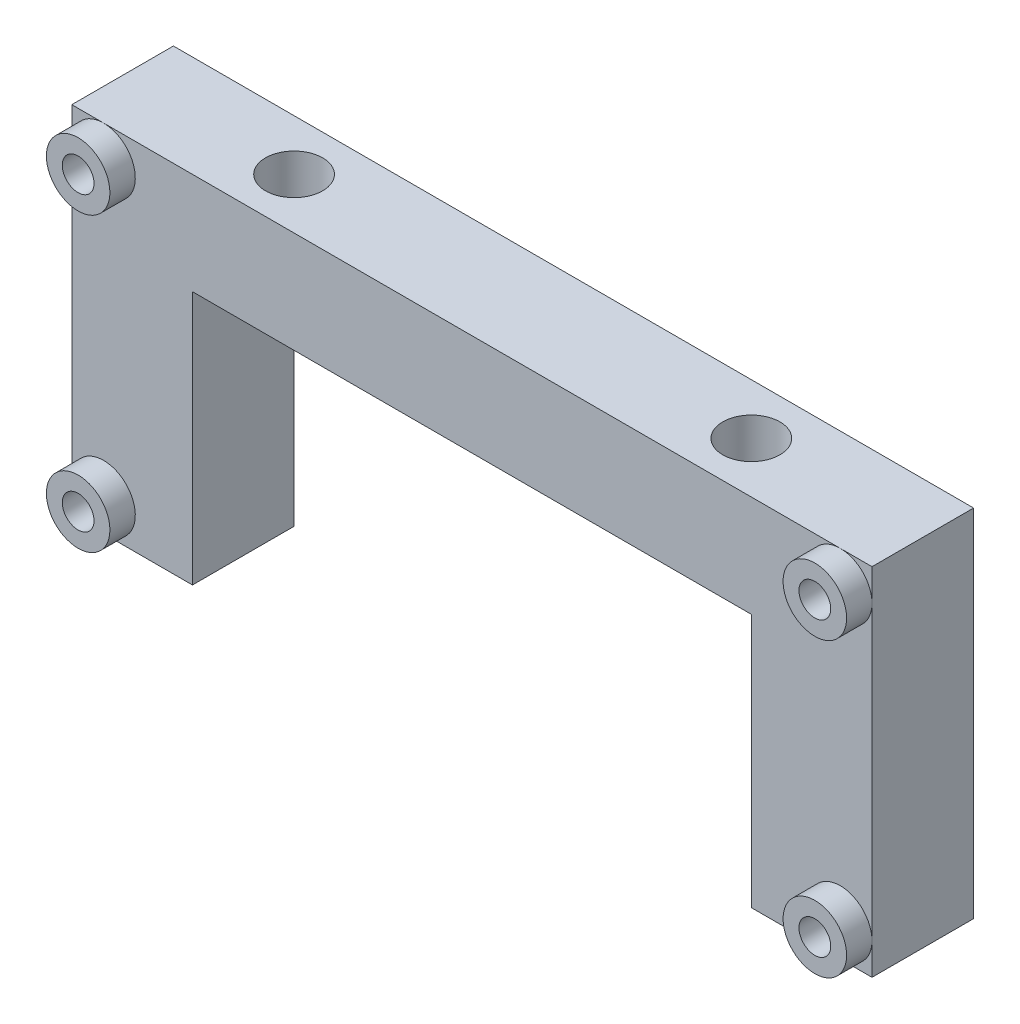
ISO-10303-21;
HEADER;
FILE_DESCRIPTION(('STEP AP214'),'2;1');
FILE_NAME('part.step','',(''),(''),'','','');
FILE_SCHEMA(('AUTOMOTIVE_DESIGN { 1 0 10303 214 1 1 1 1 }'));
ENDSEC;
DATA;
#1=APPLICATION_CONTEXT('core data for automotive mechanical design processes');
#2=APPLICATION_PROTOCOL_DEFINITION('international standard','automotive_design',2000,#1);
#3=PRODUCT_CONTEXT('',#1,'mechanical');
#4=PRODUCT('Part','Part','',(#3));
#5=PRODUCT_RELATED_PRODUCT_CATEGORY('part','',(#4));
#6=PRODUCT_DEFINITION_FORMATION('','',#4);
#7=PRODUCT_DEFINITION_CONTEXT('part definition',#1,'design');
#8=PRODUCT_DEFINITION('design','',#6,#7);
#9=PRODUCT_DEFINITION_SHAPE('','',#8);
#10=(LENGTH_UNIT() NAMED_UNIT(*) SI_UNIT(.MILLI.,.METRE.));
#11=(NAMED_UNIT(*) PLANE_ANGLE_UNIT() SI_UNIT($,.RADIAN.));
#12=(NAMED_UNIT(*) SI_UNIT($,.STERADIAN.) SOLID_ANGLE_UNIT());
#13=UNCERTAINTY_MEASURE_WITH_UNIT(LENGTH_MEASURE(1.E-05),#10,'distance_accuracy_value','');
#14=(GEOMETRIC_REPRESENTATION_CONTEXT(3) GLOBAL_UNCERTAINTY_ASSIGNED_CONTEXT((#13)) GLOBAL_UNIT_ASSIGNED_CONTEXT((#10,
#11,#12)) REPRESENTATION_CONTEXT('',''));
#15=CARTESIAN_POINT('',(0.,0.,0.));
#16=DIRECTION('',(0.,0.,1.));
#17=DIRECTION('',(1.,0.,0.));
#18=AXIS2_PLACEMENT_3D('',#15,#16,#17);
#19=CARTESIAN_POINT('',(0.,0.,8.));
#20=DIRECTION('',(0.,0.,-1.));
#21=DIRECTION('',(-1.,0.,0.));
#22=AXIS2_PLACEMENT_3D('',#19,#20,#21);
#23=PLANE('',#22);
#24=CARTESIAN_POINT('',(51.,52.5,8.));
#25=DIRECTION('',(0.,0.,1.));
#26=DIRECTION('',(1.,0.,0.));
#27=AXIS2_PLACEMENT_3D('',#24,#25,#26);
#28=CIRCLE('',#27,2.5);
#29=CARTESIAN_POINT('',(53.5,52.5,8.));
#30=VERTEX_POINT('',#29);
#31=CARTESIAN_POINT('',(51.,55.,8.));
#32=VERTEX_POINT('',#31);
#33=EDGE_CURVE('E178',#30,#32,#28,.T.);
#34=ORIENTED_EDGE('',*,*,#33,.F.);
#35=DIRECTION('',(0.,1.,0.));
#36=VECTOR('',#35,1.);
#37=CARTESIAN_POINT('',(53.5,55.,8.));
#38=LINE('',#37,#36);
#39=CARTESIAN_POINT('',(53.5,55.,8.));
#40=VERTEX_POINT('',#39);
#41=EDGE_CURVE('E229',#30,#40,#38,.T.);
#42=ORIENTED_EDGE('',*,*,#41,.T.);
#43=DIRECTION('',(-1.,0.,0.));
#44=VECTOR('',#43,1.);
#45=CARTESIAN_POINT('',(0.,55.,8.));
#46=LINE('',#45,#44);
#47=EDGE_CURVE('E41',#40,#32,#46,.T.);
#48=ORIENTED_EDGE('',*,*,#47,.T.);
#49=EDGE_LOOP('',(#34,#42,#48));
#50=FACE_BOUND('',#49,.T.);
#51=ADVANCED_FACE('F32',(#50),#23,.F.);
#52=CARTESIAN_POINT('',(51.,29.5,8.));
#53=DIRECTION('',(0.,0.,1.));
#54=DIRECTION('',(1.,0.,0.));
#55=AXIS2_PLACEMENT_3D('',#52,#53,#54);
#56=CIRCLE('',#55,2.5);
#57=CARTESIAN_POINT('',(51.,27.,8.));
#58=VERTEX_POINT('',#57);
#59=CARTESIAN_POINT('',(53.5,29.5,8.));
#60=VERTEX_POINT('',#59);
#61=EDGE_CURVE('E183',#58,#60,#56,.T.);
#62=ORIENTED_EDGE('',*,*,#61,.F.);
#63=DIRECTION('',(1.,0.,0.));
#64=VECTOR('',#63,1.);
#65=CARTESIAN_POINT('',(36.,27.,8.));
#66=LINE('',#65,#64);
#67=CARTESIAN_POINT('',(53.5,27.,8.));
#68=VERTEX_POINT('',#67);
#69=EDGE_CURVE('E226',#58,#68,#66,.T.);
#70=ORIENTED_EDGE('',*,*,#69,.T.);
#71=EDGE_CURVE('E210',#68,#60,#38,.T.);
#72=ORIENTED_EDGE('',*,*,#71,.T.);
#73=EDGE_LOOP('',(#62,#70,#72));
#74=FACE_BOUND('',#73,.T.);
#75=ADVANCED_FACE('F289',(#74),#23,.F.);
#76=CARTESIAN_POINT('',(-7.,29.5,8.));
#77=DIRECTION('',(0.,0.,1.));
#78=DIRECTION('',(1.,0.,0.));
#79=AXIS2_PLACEMENT_3D('',#76,#77,#78);
#80=CIRCLE('',#79,2.5);
#81=CARTESIAN_POINT('',(-9.49999999999999,29.5,8.));
#82=VERTEX_POINT('',#81);
#83=CARTESIAN_POINT('',(-7.,27.,8.));
#84=VERTEX_POINT('',#83);
#85=EDGE_CURVE('E196',#82,#84,#80,.T.);
#86=ORIENTED_EDGE('',*,*,#85,.F.);
#87=DIRECTION('',(0.,-1.,0.));
#88=VECTOR('',#87,1.);
#89=CARTESIAN_POINT('',(-9.5,55.,8.));
#90=LINE('',#89,#88);
#91=CARTESIAN_POINT('',(-9.49999999999999,27.,8.));
#92=VERTEX_POINT('',#91);
#93=EDGE_CURVE('E203',#82,#92,#90,.T.);
#94=ORIENTED_EDGE('',*,*,#93,.T.);
#95=DIRECTION('',(1.,0.,0.));
#96=VECTOR('',#95,1.);
#97=CARTESIAN_POINT('',(-9.49999999999999,27.,8.));
#98=LINE('',#97,#96);
#99=EDGE_CURVE('E223',#92,#84,#98,.T.);
#100=ORIENTED_EDGE('',*,*,#99,.T.);
#101=EDGE_LOOP('',(#86,#94,#100));
#102=FACE_BOUND('',#101,.T.);
#103=ADVANCED_FACE('F274',(#102),#23,.F.);
#104=CARTESIAN_POINT('',(-7.,52.5,8.));
#105=DIRECTION('',(0.,0.,1.));
#106=DIRECTION('',(1.,0.,0.));
#107=AXIS2_PLACEMENT_3D('',#104,#105,#106);
#108=CIRCLE('',#107,2.5);
#109=CARTESIAN_POINT('',(-7.,55.,8.));
#110=VERTEX_POINT('',#109);
#111=CARTESIAN_POINT('',(-9.5,52.5,8.));
#112=VERTEX_POINT('',#111);
#113=EDGE_CURVE('E43',#110,#112,#108,.T.);
#114=ORIENTED_EDGE('',*,*,#113,.F.);
#115=CARTESIAN_POINT('',(-9.5,55.,8.));
#116=VERTEX_POINT('',#115);
#117=EDGE_CURVE('E249',#110,#116,#46,.T.);
#118=ORIENTED_EDGE('',*,*,#117,.T.);
#119=EDGE_CURVE('E218',#116,#112,#90,.T.);
#120=ORIENTED_EDGE('',*,*,#119,.T.);
#121=EDGE_LOOP('',(#114,#118,#120));
#122=FACE_BOUND('',#121,.T.);
#123=ADVANCED_FACE('F282',(#122),#23,.F.);
#124=CARTESIAN_POINT('',(0.,27.,8.));
#125=VERTEX_POINT('',#124);
#126=EDGE_CURVE('E221',#84,#125,#98,.T.);
#127=ORIENTED_EDGE('',*,*,#126,.T.);
#128=DIRECTION('',(0.,-1.,0.));
#129=VECTOR('',#128,1.);
#130=CARTESIAN_POINT('',(0.,0.,8.));
#131=LINE('',#130,#129);
#132=CARTESIAN_POINT('',(0.,47.,8.));
#133=VERTEX_POINT('',#132);
#134=EDGE_CURVE('E154',#133,#125,#131,.T.);
#135=ORIENTED_EDGE('',*,*,#134,.F.);
#136=DIRECTION('',(1.,0.,0.));
#137=VECTOR('',#136,1.);
#138=CARTESIAN_POINT('',(8.,47.,8.));
#139=LINE('',#138,#137);
#140=CARTESIAN_POINT('',(44.,47.,8.));
#141=VERTEX_POINT('',#140);
#142=EDGE_CURVE('E134',#133,#141,#139,.T.);
#143=ORIENTED_EDGE('',*,*,#142,.T.);
#144=DIRECTION('',(0.,1.,0.));
#145=VECTOR('',#144,1.);
#146=CARTESIAN_POINT('',(44.,0.,8.));
#147=LINE('',#146,#145);
#148=CARTESIAN_POINT('',(44.,27.,8.));
#149=VERTEX_POINT('',#148);
#150=EDGE_CURVE('E142',#149,#141,#147,.T.);
#151=ORIENTED_EDGE('',*,*,#150,.F.);
#152=EDGE_CURVE('E227',#149,#58,#66,.T.);
#153=ORIENTED_EDGE('',*,*,#152,.T.);
#154=EDGE_CURVE('E56',#60,#58,#56,.T.);
#155=ORIENTED_EDGE('',*,*,#154,.F.);
#156=EDGE_CURVE('E232',#60,#30,#38,.T.);
#157=ORIENTED_EDGE('',*,*,#156,.T.);
#158=EDGE_CURVE('E50',#32,#30,#28,.T.);
#159=ORIENTED_EDGE('',*,*,#158,.F.);
#160=EDGE_CURVE('E248',#32,#110,#46,.T.);
#161=ORIENTED_EDGE('',*,*,#160,.T.);
#162=EDGE_CURVE('E11',#112,#110,#108,.T.);
#163=ORIENTED_EDGE('',*,*,#162,.F.);
#164=EDGE_CURVE('E222',#112,#82,#90,.T.);
#165=ORIENTED_EDGE('',*,*,#164,.T.);
#166=EDGE_CURVE('E191',#84,#82,#80,.T.);
#167=ORIENTED_EDGE('',*,*,#166,.F.);
#168=EDGE_LOOP('',(#127,#135,#143,#151,#153,#155,#157,#159,#161,#163,#165,#167));
#169=FACE_BOUND('',#168,.T.);
#170=ADVANCED_FACE('F278',(#169),#23,.F.);
#171=CARTESIAN_POINT('',(0.,0.,0.));
#172=DIRECTION('',(0.,0.,-1.));
#173=DIRECTION('',(-1.,0.,0.));
#174=AXIS2_PLACEMENT_3D('',#171,#172,#173);
#175=PLANE('',#174);
#176=DIRECTION('',(0.,-1.,0.));
#177=VECTOR('',#176,1.);
#178=CARTESIAN_POINT('',(0.,0.,0.));
#179=LINE('',#178,#177);
#180=CARTESIAN_POINT('',(0.,47.,0.));
#181=VERTEX_POINT('',#180);
#182=CARTESIAN_POINT('',(0.,27.,0.));
#183=VERTEX_POINT('',#182);
#184=EDGE_CURVE('E149',#181,#183,#179,.T.);
#185=ORIENTED_EDGE('',*,*,#184,.T.);
#186=DIRECTION('',(1.,0.,0.));
#187=VECTOR('',#186,1.);
#188=CARTESIAN_POINT('',(-9.49999999999999,27.,0.));
#189=LINE('',#188,#187);
#190=CARTESIAN_POINT('',(-9.49999999999999,27.,0.));
#191=VERTEX_POINT('',#190);
#192=EDGE_CURVE('E209',#191,#183,#189,.T.);
#193=ORIENTED_EDGE('',*,*,#192,.F.);
#194=DIRECTION('',(0.,-1.,0.));
#195=VECTOR('',#194,1.);
#196=CARTESIAN_POINT('',(-9.5,55.,0.));
#197=LINE('',#196,#195);
#198=CARTESIAN_POINT('',(-9.5,55.,0.));
#199=VERTEX_POINT('',#198);
#200=EDGE_CURVE('E206',#199,#191,#197,.T.);
#201=ORIENTED_EDGE('',*,*,#200,.F.);
#202=DIRECTION('',(-1.,0.,0.));
#203=VECTOR('',#202,1.);
#204=CARTESIAN_POINT('',(0.,55.,0.));
#205=LINE('',#204,#203);
#206=CARTESIAN_POINT('',(53.5,55.,0.));
#207=VERTEX_POINT('',#206);
#208=EDGE_CURVE('E36',#207,#199,#205,.T.);
#209=ORIENTED_EDGE('',*,*,#208,.F.);
#210=DIRECTION('',(0.,1.,0.));
#211=VECTOR('',#210,1.);
#212=CARTESIAN_POINT('',(53.5,55.,0.));
#213=LINE('',#212,#211);
#214=CARTESIAN_POINT('',(53.5,27.,0.));
#215=VERTEX_POINT('',#214);
#216=EDGE_CURVE('E214',#215,#207,#213,.T.);
#217=ORIENTED_EDGE('',*,*,#216,.F.);
#218=DIRECTION('',(1.,0.,0.));
#219=VECTOR('',#218,1.);
#220=CARTESIAN_POINT('',(36.,27.,0.));
#221=LINE('',#220,#219);
#222=CARTESIAN_POINT('',(44.,27.,0.));
#223=VERTEX_POINT('',#222);
#224=EDGE_CURVE('E148',#223,#215,#221,.T.);
#225=ORIENTED_EDGE('',*,*,#224,.F.);
#226=DIRECTION('',(0.,1.,0.));
#227=VECTOR('',#226,1.);
#228=CARTESIAN_POINT('',(44.,0.,0.));
#229=LINE('',#228,#227);
#230=CARTESIAN_POINT('',(44.,47.,0.));
#231=VERTEX_POINT('',#230);
#232=EDGE_CURVE('E139',#223,#231,#229,.T.);
#233=ORIENTED_EDGE('',*,*,#232,.T.);
#234=DIRECTION('',(1.,0.,0.));
#235=VECTOR('',#234,1.);
#236=CARTESIAN_POINT('',(8.,47.,0.));
#237=LINE('',#236,#235);
#238=EDGE_CURVE('E123',#181,#231,#237,.T.);
#239=ORIENTED_EDGE('',*,*,#238,.F.);
#240=EDGE_LOOP('',(#185,#193,#201,#209,#217,#225,#233,#239));
#241=FACE_BOUND('',#240,.T.);
#242=CARTESIAN_POINT('',(51.,29.5,0.));
#243=DIRECTION('',(0.,0.,1.));
#244=DIRECTION('',(1.,0.,0.));
#245=AXIS2_PLACEMENT_3D('',#242,#243,#244);
#246=CIRCLE('',#245,1.25);
#247=CARTESIAN_POINT('',(52.25,29.5,0.));
#248=VERTEX_POINT('',#247);
#249=EDGE_CURVE('E133',#248,#248,#246,.T.);
#250=ORIENTED_EDGE('',*,*,#249,.T.);
#251=EDGE_LOOP('',(#250));
#252=FACE_BOUND('',#251,.T.);
#253=CARTESIAN_POINT('',(51.,52.5,0.));
#254=DIRECTION('',(0.,0.,1.));
#255=DIRECTION('',(1.,0.,0.));
#256=AXIS2_PLACEMENT_3D('',#253,#254,#255);
#257=CIRCLE('',#256,1.25);
#258=CARTESIAN_POINT('',(52.25,52.5,0.));
#259=VERTEX_POINT('',#258);
#260=EDGE_CURVE('E162',#259,#259,#257,.T.);
#261=ORIENTED_EDGE('',*,*,#260,.T.);
#262=EDGE_LOOP('',(#261));
#263=FACE_BOUND('',#262,.T.);
#264=CARTESIAN_POINT('',(-7.,29.5,0.));
#265=DIRECTION('',(0.,0.,1.));
#266=DIRECTION('',(1.,0.,0.));
#267=AXIS2_PLACEMENT_3D('',#264,#265,#266);
#268=CIRCLE('',#267,1.25);
#269=CARTESIAN_POINT('',(-5.75,29.5,0.));
#270=VERTEX_POINT('',#269);
#271=EDGE_CURVE('E165',#270,#270,#268,.T.);
#272=ORIENTED_EDGE('',*,*,#271,.T.);
#273=EDGE_LOOP('',(#272));
#274=FACE_BOUND('',#273,.T.);
#275=CARTESIAN_POINT('',(-7.,52.5,0.));
#276=DIRECTION('',(0.,0.,1.));
#277=DIRECTION('',(1.,0.,0.));
#278=AXIS2_PLACEMENT_3D('',#275,#276,#277);
#279=CIRCLE('',#278,1.25);
#280=CARTESIAN_POINT('',(-5.75,52.5,0.));
#281=VERTEX_POINT('',#280);
#282=EDGE_CURVE('E168',#281,#281,#279,.T.);
#283=ORIENTED_EDGE('',*,*,#282,.T.);
#284=EDGE_LOOP('',(#283));
#285=FACE_BOUND('',#284,.T.);
#286=ADVANCED_FACE('F145',(#241,#252,#263,#274,#285),#175,.T.);
#287=CARTESIAN_POINT('',(0.,55.,8.));
#288=DIRECTION('',(0.,-1.,0.));
#289=DIRECTION('',(0.,0.,-1.));
#290=AXIS2_PLACEMENT_3D('',#287,#288,#289);
#291=PLANE('',#290);
#292=CARTESIAN_POINT('',(40.,55.,4.));
#293=DIRECTION('',(0.,-1.,0.));
#294=DIRECTION('',(0.,0.,-1.));
#295=AXIS2_PLACEMENT_3D('',#292,#293,#294);
#296=CIRCLE('',#295,2.25);
#297=CARTESIAN_POINT('',(40.,55.,1.75));
#298=VERTEX_POINT('',#297);
#299=EDGE_CURVE('E368',#298,#298,#296,.T.);
#300=ORIENTED_EDGE('',*,*,#299,.T.);
#301=EDGE_LOOP('',(#300));
#302=FACE_BOUND('',#301,.T.);
#303=CARTESIAN_POINT('',(4.,55.,4.));
#304=DIRECTION('',(0.,-1.,0.));
#305=DIRECTION('',(0.,0.,-1.));
#306=AXIS2_PLACEMENT_3D('',#303,#304,#305);
#307=CIRCLE('',#306,2.25);
#308=CARTESIAN_POINT('',(4.,55.,1.75));
#309=VERTEX_POINT('',#308);
#310=EDGE_CURVE('E156',#309,#309,#307,.T.);
#311=ORIENTED_EDGE('',*,*,#310,.T.);
#312=EDGE_LOOP('',(#311));
#313=FACE_BOUND('',#312,.T.);
#314=ORIENTED_EDGE('',*,*,#208,.T.);
#315=DIRECTION('',(0.,0.,1.));
#316=VECTOR('',#315,1.);
#317=CARTESIAN_POINT('',(-9.5,55.,0.));
#318=LINE('',#317,#316);
#319=EDGE_CURVE('E233',#199,#116,#318,.T.);
#320=ORIENTED_EDGE('',*,*,#319,.T.);
#321=ORIENTED_EDGE('',*,*,#117,.F.);
#322=ORIENTED_EDGE('',*,*,#160,.F.);
#323=ORIENTED_EDGE('',*,*,#47,.F.);
#324=DIRECTION('',(0.,0.,1.));
#325=VECTOR('',#324,1.);
#326=CARTESIAN_POINT('',(53.5,55.,0.));
#327=LINE('',#326,#325);
#328=EDGE_CURVE('E237',#207,#40,#327,.T.);
#329=ORIENTED_EDGE('',*,*,#328,.F.);
#330=EDGE_LOOP('',(#314,#320,#321,#322,#323,#329));
#331=FACE_BOUND('',#330,.T.);
#332=ADVANCED_FACE('F34',(#302,#313,#331),#291,.F.);
#333=CARTESIAN_POINT('',(-9.5,55.,0.));
#334=DIRECTION('',(-1.,0.,0.));
#335=DIRECTION('',(0.,-1.,0.));
#336=AXIS2_PLACEMENT_3D('',#333,#334,#335);
#337=PLANE('',#336);
#338=ORIENTED_EDGE('',*,*,#119,.F.);
#339=ORIENTED_EDGE('',*,*,#319,.F.);
#340=ORIENTED_EDGE('',*,*,#200,.T.);
#341=DIRECTION('',(0.,0.,1.));
#342=VECTOR('',#341,1.);
#343=CARTESIAN_POINT('',(-9.49999999999999,27.,0.));
#344=LINE('',#343,#342);
#345=EDGE_CURVE('E217',#191,#92,#344,.T.);
#346=ORIENTED_EDGE('',*,*,#345,.T.);
#347=ORIENTED_EDGE('',*,*,#93,.F.);
#348=ORIENTED_EDGE('',*,*,#164,.F.);
#349=EDGE_LOOP('',(#338,#339,#340,#346,#347,#348));
#350=FACE_BOUND('',#349,.T.);
#351=ADVANCED_FACE('F262',(#350),#337,.T.);
#352=CARTESIAN_POINT('',(-9.49999999999999,27.,0.));
#353=DIRECTION('',(0.,-1.,0.));
#354=DIRECTION('',(0.,0.,-1.));
#355=AXIS2_PLACEMENT_3D('',#352,#353,#354);
#356=PLANE('',#355);
#357=DIRECTION('',(0.,0.,-1.));
#358=VECTOR('',#357,1.);
#359=CARTESIAN_POINT('',(0.,27.,8.));
#360=LINE('',#359,#358);
#361=EDGE_CURVE('E236',#125,#183,#360,.T.);
#362=ORIENTED_EDGE('',*,*,#361,.F.);
#363=ORIENTED_EDGE('',*,*,#126,.F.);
#364=ORIENTED_EDGE('',*,*,#99,.F.);
#365=ORIENTED_EDGE('',*,*,#345,.F.);
#366=ORIENTED_EDGE('',*,*,#192,.T.);
#367=EDGE_LOOP('',(#362,#363,#364,#365,#366));
#368=FACE_BOUND('',#367,.T.);
#369=ADVANCED_FACE('F267',(#368),#356,.T.);
#370=CARTESIAN_POINT('',(36.,27.,0.));
#371=DIRECTION('',(0.,-1.,0.));
#372=DIRECTION('',(0.,0.,-1.));
#373=AXIS2_PLACEMENT_3D('',#370,#371,#372);
#374=PLANE('',#373);
#375=DIRECTION('',(0.,0.,1.));
#376=VECTOR('',#375,1.);
#377=CARTESIAN_POINT('',(44.,27.,8.));
#378=LINE('',#377,#376);
#379=EDGE_CURVE('E246',#223,#149,#378,.T.);
#380=ORIENTED_EDGE('',*,*,#379,.F.);
#381=ORIENTED_EDGE('',*,*,#224,.T.);
#382=DIRECTION('',(0.,0.,1.));
#383=VECTOR('',#382,1.);
#384=CARTESIAN_POINT('',(53.5,27.,0.));
#385=LINE('',#384,#383);
#386=EDGE_CURVE('E240',#215,#68,#385,.T.);
#387=ORIENTED_EDGE('',*,*,#386,.T.);
#388=ORIENTED_EDGE('',*,*,#69,.F.);
#389=ORIENTED_EDGE('',*,*,#152,.F.);
#390=EDGE_LOOP('',(#380,#381,#387,#388,#389));
#391=FACE_BOUND('',#390,.T.);
#392=ADVANCED_FACE('F351',(#391),#374,.T.);
#393=CARTESIAN_POINT('',(53.5,55.,0.));
#394=DIRECTION('',(1.,0.,0.));
#395=DIRECTION('',(0.,0.,-1.));
#396=AXIS2_PLACEMENT_3D('',#393,#394,#395);
#397=PLANE('',#396);
#398=ORIENTED_EDGE('',*,*,#71,.F.);
#399=ORIENTED_EDGE('',*,*,#386,.F.);
#400=ORIENTED_EDGE('',*,*,#216,.T.);
#401=ORIENTED_EDGE('',*,*,#328,.T.);
#402=ORIENTED_EDGE('',*,*,#41,.F.);
#403=ORIENTED_EDGE('',*,*,#156,.F.);
#404=EDGE_LOOP('',(#398,#399,#400,#401,#402,#403));
#405=FACE_BOUND('',#404,.T.);
#406=ADVANCED_FACE('F344',(#405),#397,.T.);
#407=CARTESIAN_POINT('',(-7.,52.5,10.));
#408=DIRECTION('',(0.,0.,1.));
#409=DIRECTION('',(1.,0.,0.));
#410=AXIS2_PLACEMENT_3D('',#407,#408,#409);
#411=PLANE('',#410);
#412=CARTESIAN_POINT('',(-7.,52.5,10.));
#413=DIRECTION('',(0.,0.,1.));
#414=DIRECTION('',(1.,0.,0.));
#415=AXIS2_PLACEMENT_3D('',#412,#413,#414);
#416=CIRCLE('',#415,2.5);
#417=CARTESIAN_POINT('',(-4.5,52.5,10.));
#418=VERTEX_POINT('',#417);
#419=EDGE_CURVE('E201',#418,#418,#416,.T.);
#420=ORIENTED_EDGE('',*,*,#419,.T.);
#421=EDGE_LOOP('',(#420));
#422=FACE_BOUND('',#421,.T.);
#423=CARTESIAN_POINT('',(-7.,52.5,10.));
#424=DIRECTION('',(0.,0.,1.));
#425=DIRECTION('',(1.,0.,0.));
#426=AXIS2_PLACEMENT_3D('',#423,#424,#425);
#427=CIRCLE('',#426,1.25);
#428=CARTESIAN_POINT('',(-5.75,52.5,10.));
#429=VERTEX_POINT('',#428);
#430=EDGE_CURVE('E195',#429,#429,#427,.T.);
#431=ORIENTED_EDGE('',*,*,#430,.F.);
#432=EDGE_LOOP('',(#431));
#433=FACE_BOUND('',#432,.T.);
#434=ADVANCED_FACE('F341',(#422,#433),#411,.T.);
#435=CARTESIAN_POINT('',(-7.,52.5,10.));
#436=DIRECTION('',(0.,0.,-1.));
#437=DIRECTION('',(-1.,0.,0.));
#438=AXIS2_PLACEMENT_3D('',#435,#436,#437);
#439=CYLINDRICAL_SURFACE('',#438,2.5);
#440=ORIENTED_EDGE('',*,*,#419,.F.);
#441=EDGE_LOOP('',(#440));
#442=FACE_BOUND('',#441,.T.);
#443=ORIENTED_EDGE('',*,*,#113,.T.);
#444=ORIENTED_EDGE('',*,*,#162,.T.);
#445=EDGE_LOOP('',(#443,#444));
#446=FACE_BOUND('',#445,.T.);
#447=ADVANCED_FACE('F281',(#442,#446),#439,.T.);
#448=CARTESIAN_POINT('',(-7.,52.5,10.));
#449=DIRECTION('',(0.,0.,-1.));
#450=DIRECTION('',(-1.,0.,0.));
#451=AXIS2_PLACEMENT_3D('',#448,#449,#450);
#452=CYLINDRICAL_SURFACE('',#451,1.25);
#453=ORIENTED_EDGE('',*,*,#430,.T.);
#454=EDGE_LOOP('',(#453));
#455=FACE_BOUND('',#454,.T.);
#456=ORIENTED_EDGE('',*,*,#282,.F.);
#457=EDGE_LOOP('',(#456));
#458=FACE_BOUND('',#457,.T.);
#459=ADVANCED_FACE('F333',(#455,#458),#452,.F.);
#460=CARTESIAN_POINT('',(-7.,29.5,10.));
#461=DIRECTION('',(0.,0.,1.));
#462=DIRECTION('',(1.,0.,0.));
#463=AXIS2_PLACEMENT_3D('',#460,#461,#462);
#464=PLANE('',#463);
#465=CARTESIAN_POINT('',(-7.,29.5,10.));
#466=DIRECTION('',(0.,0.,1.));
#467=DIRECTION('',(1.,0.,0.));
#468=AXIS2_PLACEMENT_3D('',#465,#466,#467);
#469=CIRCLE('',#468,2.5);
#470=CARTESIAN_POINT('',(-4.49999999999999,29.5,10.));
#471=VERTEX_POINT('',#470);
#472=EDGE_CURVE('E192',#471,#471,#469,.T.);
#473=ORIENTED_EDGE('',*,*,#472,.T.);
#474=EDGE_LOOP('',(#473));
#475=FACE_BOUND('',#474,.T.);
#476=CARTESIAN_POINT('',(-7.,29.5,10.));
#477=DIRECTION('',(0.,0.,1.));
#478=DIRECTION('',(1.,0.,0.));
#479=AXIS2_PLACEMENT_3D('',#476,#477,#478);
#480=CIRCLE('',#479,1.25);
#481=CARTESIAN_POINT('',(-5.75,29.5,10.));
#482=VERTEX_POINT('',#481);
#483=EDGE_CURVE('E187',#482,#482,#480,.T.);
#484=ORIENTED_EDGE('',*,*,#483,.F.);
#485=EDGE_LOOP('',(#484));
#486=FACE_BOUND('',#485,.T.);
#487=ADVANCED_FACE('F330',(#475,#486),#464,.T.);
#488=CARTESIAN_POINT('',(-7.,29.5,10.));
#489=DIRECTION('',(0.,0.,-1.));
#490=DIRECTION('',(-1.,0.,0.));
#491=AXIS2_PLACEMENT_3D('',#488,#489,#490);
#492=CYLINDRICAL_SURFACE('',#491,2.5);
#493=ORIENTED_EDGE('',*,*,#472,.F.);
#494=EDGE_LOOP('',(#493));
#495=FACE_BOUND('',#494,.T.);
#496=ORIENTED_EDGE('',*,*,#85,.T.);
#497=ORIENTED_EDGE('',*,*,#166,.T.);
#498=EDGE_LOOP('',(#496,#497));
#499=FACE_BOUND('',#498,.T.);
#500=ADVANCED_FACE('F276',(#495,#499),#492,.T.);
#501=CARTESIAN_POINT('',(-7.,29.5,10.));
#502=DIRECTION('',(0.,0.,-1.));
#503=DIRECTION('',(-1.,0.,0.));
#504=AXIS2_PLACEMENT_3D('',#501,#502,#503);
#505=CYLINDRICAL_SURFACE('',#504,1.25);
#506=ORIENTED_EDGE('',*,*,#483,.T.);
#507=EDGE_LOOP('',(#506));
#508=FACE_BOUND('',#507,.T.);
#509=ORIENTED_EDGE('',*,*,#271,.F.);
#510=EDGE_LOOP('',(#509));
#511=FACE_BOUND('',#510,.T.);
#512=ADVANCED_FACE('F322',(#508,#511),#505,.F.);
#513=CARTESIAN_POINT('',(51.,29.5,10.));
#514=DIRECTION('',(0.,0.,1.));
#515=DIRECTION('',(1.,0.,0.));
#516=AXIS2_PLACEMENT_3D('',#513,#514,#515);
#517=PLANE('',#516);
#518=CARTESIAN_POINT('',(51.,29.5,10.));
#519=DIRECTION('',(0.,0.,1.));
#520=DIRECTION('',(1.,0.,0.));
#521=AXIS2_PLACEMENT_3D('',#518,#519,#520);
#522=CIRCLE('',#521,2.5);
#523=CARTESIAN_POINT('',(53.5,29.5,10.));
#524=VERTEX_POINT('',#523);
#525=EDGE_CURVE('E184',#524,#524,#522,.T.);
#526=ORIENTED_EDGE('',*,*,#525,.T.);
#527=EDGE_LOOP('',(#526));
#528=FACE_BOUND('',#527,.T.);
#529=CARTESIAN_POINT('',(51.,29.5,10.));
#530=DIRECTION('',(0.,0.,1.));
#531=DIRECTION('',(1.,0.,0.));
#532=AXIS2_PLACEMENT_3D('',#529,#530,#531);
#533=CIRCLE('',#532,1.25);
#534=CARTESIAN_POINT('',(52.25,29.5,10.));
#535=VERTEX_POINT('',#534);
#536=EDGE_CURVE('E177',#535,#535,#533,.T.);
#537=ORIENTED_EDGE('',*,*,#536,.F.);
#538=EDGE_LOOP('',(#537));
#539=FACE_BOUND('',#538,.T.);
#540=ADVANCED_FACE('F319',(#528,#539),#517,.T.);
#541=CARTESIAN_POINT('',(51.,29.5,10.));
#542=DIRECTION('',(0.,0.,-1.));
#543=DIRECTION('',(-1.,0.,0.));
#544=AXIS2_PLACEMENT_3D('',#541,#542,#543);
#545=CYLINDRICAL_SURFACE('',#544,2.5);
#546=ORIENTED_EDGE('',*,*,#525,.F.);
#547=EDGE_LOOP('',(#546));
#548=FACE_BOUND('',#547,.T.);
#549=ORIENTED_EDGE('',*,*,#154,.T.);
#550=ORIENTED_EDGE('',*,*,#61,.T.);
#551=EDGE_LOOP('',(#549,#550));
#552=FACE_BOUND('',#551,.T.);
#553=ADVANCED_FACE('F317',(#548,#552),#545,.T.);
#554=CARTESIAN_POINT('',(51.,29.5,10.));
#555=DIRECTION('',(0.,0.,-1.));
#556=DIRECTION('',(-1.,0.,0.));
#557=AXIS2_PLACEMENT_3D('',#554,#555,#556);
#558=CYLINDRICAL_SURFACE('',#557,1.25);
#559=ORIENTED_EDGE('',*,*,#536,.T.);
#560=EDGE_LOOP('',(#559));
#561=FACE_BOUND('',#560,.T.);
#562=ORIENTED_EDGE('',*,*,#249,.F.);
#563=EDGE_LOOP('',(#562));
#564=FACE_BOUND('',#563,.T.);
#565=ADVANCED_FACE('F310',(#561,#564),#558,.F.);
#566=CARTESIAN_POINT('',(51.,52.5,10.));
#567=DIRECTION('',(0.,0.,1.));
#568=DIRECTION('',(1.,0.,0.));
#569=AXIS2_PLACEMENT_3D('',#566,#567,#568);
#570=PLANE('',#569);
#571=CARTESIAN_POINT('',(51.,52.5,10.));
#572=DIRECTION('',(0.,0.,1.));
#573=DIRECTION('',(1.,0.,0.));
#574=AXIS2_PLACEMENT_3D('',#571,#572,#573);
#575=CIRCLE('',#574,2.5);
#576=CARTESIAN_POINT('',(53.5,52.5,10.));
#577=VERTEX_POINT('',#576);
#578=EDGE_CURVE('E174',#577,#577,#575,.T.);
#579=ORIENTED_EDGE('',*,*,#578,.T.);
#580=EDGE_LOOP('',(#579));
#581=FACE_BOUND('',#580,.T.);
#582=CARTESIAN_POINT('',(51.,52.5,10.));
#583=DIRECTION('',(0.,0.,1.));
#584=DIRECTION('',(1.,0.,0.));
#585=AXIS2_PLACEMENT_3D('',#582,#583,#584);
#586=CIRCLE('',#585,1.25);
#587=CARTESIAN_POINT('',(52.25,52.5,10.));
#588=VERTEX_POINT('',#587);
#589=EDGE_CURVE('E171',#588,#588,#586,.T.);
#590=ORIENTED_EDGE('',*,*,#589,.F.);
#591=EDGE_LOOP('',(#590));
#592=FACE_BOUND('',#591,.T.);
#593=ADVANCED_FACE('F301',(#581,#592),#570,.T.);
#594=CARTESIAN_POINT('',(51.,52.5,10.));
#595=DIRECTION('',(0.,0.,-1.));
#596=DIRECTION('',(-1.,0.,0.));
#597=AXIS2_PLACEMENT_3D('',#594,#595,#596);
#598=CYLINDRICAL_SURFACE('',#597,2.5);
#599=ORIENTED_EDGE('',*,*,#578,.F.);
#600=EDGE_LOOP('',(#599));
#601=FACE_BOUND('',#600,.T.);
#602=ORIENTED_EDGE('',*,*,#33,.T.);
#603=ORIENTED_EDGE('',*,*,#158,.T.);
#604=EDGE_LOOP('',(#602,#603));
#605=FACE_BOUND('',#604,.T.);
#606=ADVANCED_FACE('F298',(#601,#605),#598,.T.);
#607=CARTESIAN_POINT('',(51.,52.5,10.));
#608=DIRECTION('',(0.,0.,-1.));
#609=DIRECTION('',(-1.,0.,0.));
#610=AXIS2_PLACEMENT_3D('',#607,#608,#609);
#611=CYLINDRICAL_SURFACE('',#610,1.25);
#612=ORIENTED_EDGE('',*,*,#589,.T.);
#613=EDGE_LOOP('',(#612));
#614=FACE_BOUND('',#613,.T.);
#615=ORIENTED_EDGE('',*,*,#260,.F.);
#616=EDGE_LOOP('',(#615));
#617=FACE_BOUND('',#616,.T.);
#618=ADVANCED_FACE('F300',(#614,#617),#611,.F.);
#619=CARTESIAN_POINT('',(8.,47.,0.));
#620=DIRECTION('',(0.,-1.,0.));
#621=DIRECTION('',(0.,0.,-1.));
#622=AXIS2_PLACEMENT_3D('',#619,#620,#621);
#623=PLANE('',#622);
#624=CARTESIAN_POINT('',(40.,47.,4.));
#625=DIRECTION('',(0.,-1.,0.));
#626=DIRECTION('',(0.,0.,-1.));
#627=AXIS2_PLACEMENT_3D('',#624,#625,#626);
#628=CIRCLE('',#627,2.25);
#629=CARTESIAN_POINT('',(40.,47.,1.75));
#630=VERTEX_POINT('',#629);
#631=EDGE_CURVE('E376',#630,#630,#628,.T.);
#632=ORIENTED_EDGE('',*,*,#631,.F.);
#633=EDGE_LOOP('',(#632));
#634=FACE_BOUND('',#633,.T.);
#635=CARTESIAN_POINT('',(4.,47.,4.));
#636=DIRECTION('',(0.,-1.,0.));
#637=DIRECTION('',(0.,0.,-1.));
#638=AXIS2_PLACEMENT_3D('',#635,#636,#637);
#639=CIRCLE('',#638,2.25);
#640=CARTESIAN_POINT('',(4.,47.,1.75));
#641=VERTEX_POINT('',#640);
#642=EDGE_CURVE('E372',#641,#641,#639,.T.);
#643=ORIENTED_EDGE('',*,*,#642,.F.);
#644=EDGE_LOOP('',(#643));
#645=FACE_BOUND('',#644,.T.);
#646=ORIENTED_EDGE('',*,*,#142,.F.);
#647=DIRECTION('',(0.,0.,1.));
#648=VECTOR('',#647,1.);
#649=CARTESIAN_POINT('',(0.,47.,0.));
#650=LINE('',#649,#648);
#651=EDGE_CURVE('E128',#181,#133,#650,.T.);
#652=ORIENTED_EDGE('',*,*,#651,.F.);
#653=ORIENTED_EDGE('',*,*,#238,.T.);
#654=DIRECTION('',(0.,0.,1.));
#655=VECTOR('',#654,1.);
#656=CARTESIAN_POINT('',(44.,47.,0.));
#657=LINE('',#656,#655);
#658=EDGE_CURVE('E126',#231,#141,#657,.T.);
#659=ORIENTED_EDGE('',*,*,#658,.T.);
#660=EDGE_LOOP('',(#646,#652,#653,#659));
#661=FACE_BOUND('',#660,.T.);
#662=ADVANCED_FACE('F125',(#634,#645,#661),#623,.T.);
#663=CARTESIAN_POINT('',(44.,0.,0.));
#664=DIRECTION('',(1.,0.,0.));
#665=DIRECTION('',(0.,0.,-1.));
#666=AXIS2_PLACEMENT_3D('',#663,#664,#665);
#667=PLANE('',#666);
#668=ORIENTED_EDGE('',*,*,#379,.T.);
#669=ORIENTED_EDGE('',*,*,#150,.T.);
#670=ORIENTED_EDGE('',*,*,#658,.F.);
#671=ORIENTED_EDGE('',*,*,#232,.F.);
#672=EDGE_LOOP('',(#668,#669,#670,#671));
#673=FACE_BOUND('',#672,.T.);
#674=ADVANCED_FACE('F138',(#673),#667,.F.);
#675=CARTESIAN_POINT('',(0.,0.,0.));
#676=DIRECTION('',(-1.,0.,0.));
#677=DIRECTION('',(0.,0.,1.));
#678=AXIS2_PLACEMENT_3D('',#675,#676,#677);
#679=PLANE('',#678);
#680=ORIENTED_EDGE('',*,*,#361,.T.);
#681=ORIENTED_EDGE('',*,*,#184,.F.);
#682=ORIENTED_EDGE('',*,*,#651,.T.);
#683=ORIENTED_EDGE('',*,*,#134,.T.);
#684=EDGE_LOOP('',(#680,#681,#682,#683));
#685=FACE_BOUND('',#684,.T.);
#686=ADVANCED_FACE('F390',(#685),#679,.F.);
#687=CARTESIAN_POINT('',(4.,55.,4.));
#688=DIRECTION('',(0.,-1.,0.));
#689=DIRECTION('',(0.,0.,-1.));
#690=AXIS2_PLACEMENT_3D('',#687,#688,#689);
#691=CYLINDRICAL_SURFACE('',#690,2.25);
#692=ORIENTED_EDGE('',*,*,#310,.F.);
#693=EDGE_LOOP('',(#692));
#694=FACE_BOUND('',#693,.T.);
#695=ORIENTED_EDGE('',*,*,#642,.T.);
#696=EDGE_LOOP('',(#695));
#697=FACE_BOUND('',#696,.T.);
#698=ADVANCED_FACE('F388',(#694,#697),#691,.F.);
#699=CARTESIAN_POINT('',(40.,55.,4.));
#700=DIRECTION('',(0.,-1.,0.));
#701=DIRECTION('',(0.,0.,-1.));
#702=AXIS2_PLACEMENT_3D('',#699,#700,#701);
#703=CYLINDRICAL_SURFACE('',#702,2.25);
#704=ORIENTED_EDGE('',*,*,#299,.F.);
#705=EDGE_LOOP('',(#704));
#706=FACE_BOUND('',#705,.T.);
#707=ORIENTED_EDGE('',*,*,#631,.T.);
#708=EDGE_LOOP('',(#707));
#709=FACE_BOUND('',#708,.T.);
#710=ADVANCED_FACE('F381',(#706,#709),#703,.F.);
#711=CLOSED_SHELL('',(#51,#75,#103,#123,#170,#286,#332,#351,#369,#392,#406,#434,#447,#459,#487,
#500,#512,#540,#553,#565,#593,#606,#618,#662,#674,#686,#698,#710));
#712=MANIFOLD_SOLID_BREP('B2',#711);
#713=ADVANCED_BREP_SHAPE_REPRESENTATION('',(#18,#712),#14);
#714=SHAPE_DEFINITION_REPRESENTATION(#9,#713);
ENDSEC;
END-ISO-10303-21;
